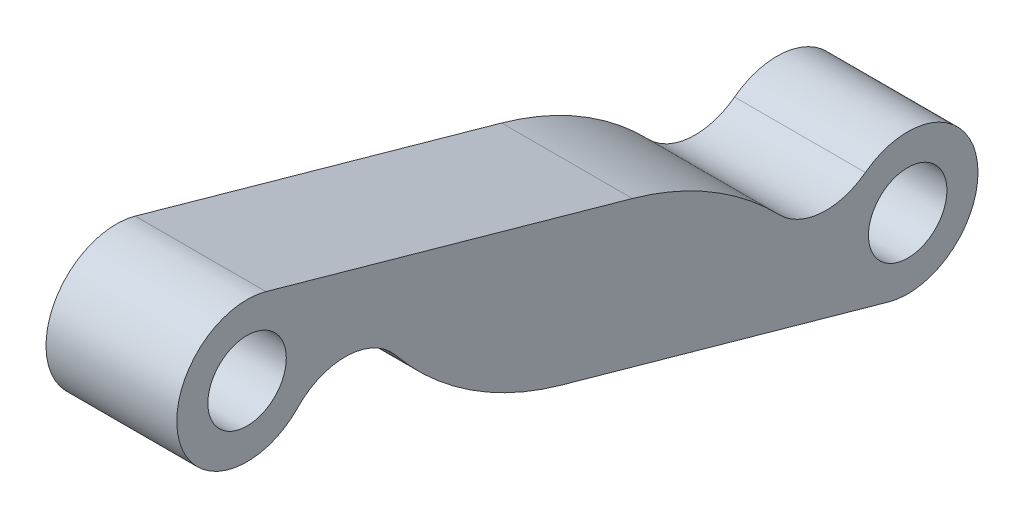
ISO-10303-21;
HEADER;
FILE_DESCRIPTION(('STEP AP214'),'2;1');
FILE_NAME('part.step','',(''),(''),'','','');
FILE_SCHEMA(('AUTOMOTIVE_DESIGN { 1 0 10303 214 1 1 1 1 }'));
ENDSEC;
DATA;
#1=APPLICATION_CONTEXT('core data for automotive mechanical design processes');
#2=APPLICATION_PROTOCOL_DEFINITION('international standard','automotive_design',2000,#1);
#3=PRODUCT_CONTEXT('',#1,'mechanical');
#4=PRODUCT('Part','Part','',(#3));
#5=PRODUCT_RELATED_PRODUCT_CATEGORY('part','',(#4));
#6=PRODUCT_DEFINITION_FORMATION('','',#4);
#7=PRODUCT_DEFINITION_CONTEXT('part definition',#1,'design');
#8=PRODUCT_DEFINITION('design','',#6,#7);
#9=PRODUCT_DEFINITION_SHAPE('','',#8);
#10=(LENGTH_UNIT() NAMED_UNIT(*) SI_UNIT(.MILLI.,.METRE.));
#11=(NAMED_UNIT(*) PLANE_ANGLE_UNIT() SI_UNIT($,.RADIAN.));
#12=(NAMED_UNIT(*) SI_UNIT($,.STERADIAN.) SOLID_ANGLE_UNIT());
#13=UNCERTAINTY_MEASURE_WITH_UNIT(LENGTH_MEASURE(1.E-05),#10,'distance_accuracy_value','');
#14=(GEOMETRIC_REPRESENTATION_CONTEXT(3) GLOBAL_UNCERTAINTY_ASSIGNED_CONTEXT((#13)) GLOBAL_UNIT_ASSIGNED_CONTEXT((#10,
#11,#12)) REPRESENTATION_CONTEXT('',''));
#15=CARTESIAN_POINT('',(0.,0.,0.));
#16=DIRECTION('',(0.,0.,1.));
#17=DIRECTION('',(1.,0.,0.));
#18=AXIS2_PLACEMENT_3D('',#15,#16,#17);
#19=CARTESIAN_POINT('',(-2.,7.67065108363029,-2.14746223561977));
#20=DIRECTION('',(0.,-0.962974451836262,0.269592665164783));
#21=DIRECTION('',(0.,-0.269592665164783,-0.962974451836262));
#22=AXIS2_PLACEMENT_3D('',#19,#20,#21);
#23=PLANE('',#22);
#24=DIRECTION('',(0.,-0.269592665164783,-0.962974451836262));
#25=VECTOR('',#24,1.);
#26=CARTESIAN_POINT('',(2.,7.67065108363029,-2.14746223561977));
#27=LINE('',#26,#25);
#28=CARTESIAN_POINT('',(2.,-2.09525455877692,-37.0308950876729));
#29=VERTEX_POINT('',#28);
#30=CARTESIAN_POINT('',(2.,-4.89882219619411,-47.0451289956227));
#31=VERTEX_POINT('',#30);
#32=EDGE_CURVE('E102',#29,#31,#27,.T.);
#33=ORIENTED_EDGE('',*,*,#32,.F.);
#34=DIRECTION('',(-1.,0.,0.));
#35=VECTOR('',#34,1.);
#36=CARTESIAN_POINT('',(-2.,-2.09525455877692,-37.0308950876729));
#37=LINE('',#36,#35);
#38=CARTESIAN_POINT('',(-2.,-2.09525455877692,-37.0308950876729));
#39=VERTEX_POINT('',#38);
#40=EDGE_CURVE('E11',#29,#39,#37,.T.);
#41=ORIENTED_EDGE('',*,*,#40,.T.);
#42=DIRECTION('',(0.,-0.269592665164783,-0.962974451836262));
#43=VECTOR('',#42,1.);
#44=CARTESIAN_POINT('',(-2.,7.67065108363029,-2.14746223561977));
#45=LINE('',#44,#43);
#46=CARTESIAN_POINT('',(-2.,-4.89882219619411,-47.0451289956227));
#47=VERTEX_POINT('',#46);
#48=EDGE_CURVE('E114',#39,#47,#45,.T.);
#49=ORIENTED_EDGE('',*,*,#48,.T.);
#50=DIRECTION('',(1.,0.,0.));
#51=VECTOR('',#50,1.);
#52=CARTESIAN_POINT('',(-2.,-4.89882219619411,-47.0451289956227));
#53=LINE('',#52,#51);
#54=EDGE_CURVE('E113',#47,#31,#53,.T.);
#55=ORIENTED_EDGE('',*,*,#54,.T.);
#56=EDGE_LOOP('',(#33,#41,#49,#55));
#57=FACE_BOUND('',#56,.T.);
#58=ADVANCED_FACE('F39',(#57),#23,.T.);
#59=CARTESIAN_POINT('',(-2.,-0.0390630670417539,-30.4186911776633));
#60=DIRECTION('',(1.,0.,0.));
#61=DIRECTION('',(0.,0.,-1.));
#62=AXIS2_PLACEMENT_3D('',#59,#60,#61);
#63=CYLINDRICAL_SURFACE('',#62,2.00000000000001);
#64=CARTESIAN_POINT('',(-2.,-0.0390630670417539,-30.4186911776633));
#65=DIRECTION('',(1.,0.,0.));
#66=DIRECTION('',(0.,0.,-1.));
#67=AXIS2_PLACEMENT_3D('',#64,#65,#66);
#68=CIRCLE('',#67,2.00000000000001);
#69=CARTESIAN_POINT('',(-2.,1.22319577072949,-31.9700462712728));
#70=VERTEX_POINT('',#69);
#71=CARTESIAN_POINT('',(-2.,1.34285991695243,-28.9729080451331));
#72=VERTEX_POINT('',#71);
#73=EDGE_CURVE('E153',#70,#72,#68,.T.);
#74=ORIENTED_EDGE('',*,*,#73,.F.);
#75=DIRECTION('',(1.,0.,0.));
#76=VECTOR('',#75,1.);
#77=CARTESIAN_POINT('',(-2.,1.22319577072949,-31.9700462712728));
#78=LINE('',#77,#76);
#79=CARTESIAN_POINT('',(2.,1.22319577072949,-31.9700462712728));
#80=VERTEX_POINT('',#79);
#81=EDGE_CURVE('E47',#70,#80,#78,.T.);
#82=ORIENTED_EDGE('',*,*,#81,.T.);
#83=CARTESIAN_POINT('',(2.,-0.0390630670417539,-30.4186911776633));
#84=DIRECTION('',(1.,0.,0.));
#85=DIRECTION('',(0.,0.,-1.));
#86=AXIS2_PLACEMENT_3D('',#83,#84,#85);
#87=CIRCLE('',#86,2.00000000000001);
#88=CARTESIAN_POINT('',(2.,1.34285991695243,-28.9729080451331));
#89=VERTEX_POINT('',#88);
#90=EDGE_CURVE('E134',#80,#89,#87,.T.);
#91=ORIENTED_EDGE('',*,*,#90,.T.);
#92=DIRECTION('',(1.,0.,0.));
#93=VECTOR('',#92,1.);
#94=CARTESIAN_POINT('',(-2.,1.34285991695243,-28.9729080451331));
#95=LINE('',#94,#93);
#96=EDGE_CURVE('E160',#72,#89,#95,.T.);
#97=ORIENTED_EDGE('',*,*,#96,.F.);
#98=EDGE_LOOP('',(#74,#82,#91,#97));
#99=FACE_BOUND('',#98,.T.);
#100=ADVANCED_FACE('F179',(#99),#63,.F.);
#101=CARTESIAN_POINT('',(-2.,2.82842712474618,-27.4186911776633));
#102=DIRECTION('',(1.,0.,0.));
#103=DIRECTION('',(0.,0.,-1.));
#104=AXIS2_PLACEMENT_3D('',#101,#102,#103);
#105=CYLINDRICAL_SURFACE('',#104,2.15);
#106=ORIENTED_EDGE('',*,*,#96,.T.);
#107=CARTESIAN_POINT('',(2.,2.82842712474618,-27.4186911776633));
#108=DIRECTION('',(1.,0.,0.));
#109=DIRECTION('',(0.,0.,-1.));
#110=AXIS2_PLACEMENT_3D('',#107,#108,#109);
#111=CIRCLE('',#110,2.15);
#112=CARTESIAN_POINT('',(2.,4.89882219619414,-27.9983154077675));
#113=VERTEX_POINT('',#112);
#114=EDGE_CURVE('E131',#113,#89,#111,.T.);
#115=ORIENTED_EDGE('',*,*,#114,.F.);
#116=DIRECTION('',(1.,0.,0.));
#117=VECTOR('',#116,1.);
#118=CARTESIAN_POINT('',(-2.,4.89882219619414,-27.9983154077675));
#119=LINE('',#118,#117);
#120=CARTESIAN_POINT('',(-2.,4.89882219619414,-27.9983154077675));
#121=VERTEX_POINT('',#120);
#122=EDGE_CURVE('E164',#121,#113,#119,.T.);
#123=ORIENTED_EDGE('',*,*,#122,.F.);
#124=CARTESIAN_POINT('',(-2.,2.82842712474618,-27.4186911776633));
#125=DIRECTION('',(1.,0.,0.));
#126=DIRECTION('',(0.,0.,-1.));
#127=AXIS2_PLACEMENT_3D('',#124,#125,#126);
#128=CIRCLE('',#127,2.15);
#129=EDGE_CURVE('E150',#121,#72,#128,.T.);
#130=ORIENTED_EDGE('',*,*,#129,.T.);
#131=EDGE_LOOP('',(#106,#115,#123,#130));
#132=FACE_BOUND('',#131,.T.);
#133=ADVANCED_FACE('F185',(#132),#105,.T.);
#134=CARTESIAN_POINT('',(-2.,11.8114412265263,-3.30671069582839));
#135=DIRECTION('',(0.,-0.962974451836261,0.269592665164785));
#136=DIRECTION('',(0.,-0.269592665164785,-0.962974451836262));
#137=AXIS2_PLACEMENT_3D('',#134,#135,#136);
#138=PLANE('',#137);
#139=DIRECTION('',(0.,-0.269592665164785,-0.962974451836262));
#140=VECTOR('',#139,1.);
#141=CARTESIAN_POINT('',(2.,11.8114412265263,-3.30671069582839));
#142=LINE('',#141,#140);
#143=CARTESIAN_POINT('',(2.,1.76159384554701,-39.2043723285039));
#144=VERTEX_POINT('',#143);
#145=EDGE_CURVE('E126',#113,#144,#142,.T.);
#146=ORIENTED_EDGE('',*,*,#145,.T.);
#147=DIRECTION('',(1.,0.,0.));
#148=VECTOR('',#147,1.);
#149=CARTESIAN_POINT('',(-2.,1.76159384554701,-39.2043723285039));
#150=LINE('',#149,#148);
#151=CARTESIAN_POINT('',(-2.,1.76159384554701,-39.2043723285039));
#152=VERTEX_POINT('',#151);
#153=EDGE_CURVE('E172',#144,#152,#150,.F.);
#154=ORIENTED_EDGE('',*,*,#153,.T.);
#155=DIRECTION('',(0.,-0.269592665164785,-0.962974451836262));
#156=VECTOR('',#155,1.);
#157=CARTESIAN_POINT('',(-2.,11.8114412265263,-3.30671069582839));
#158=LINE('',#157,#156);
#159=EDGE_CURVE('E147',#121,#152,#158,.T.);
#160=ORIENTED_EDGE('',*,*,#159,.F.);
#161=ORIENTED_EDGE('',*,*,#122,.T.);
#162=EDGE_LOOP('',(#146,#154,#160,#161));
#163=FACE_BOUND('',#162,.T.);
#164=ADVANCED_FACE('F199',(#163),#138,.F.);
#165=CARTESIAN_POINT('',(-2.,0.484049290264224,-45.1247532257269));
#166=DIRECTION('',(1.,0.,0.));
#167=DIRECTION('',(0.,0.,-1.));
#168=AXIS2_PLACEMENT_3D('',#165,#166,#167);
#169=CYLINDRICAL_SURFACE('',#168,2.);
#170=CARTESIAN_POINT('',(-2.,0.484049290264224,-45.1247532257269));
#171=DIRECTION('',(1.,0.,0.));
#172=DIRECTION('',(0.,0.,-1.));
#173=AXIS2_PLACEMENT_3D('',#170,#171,#172);
#174=CIRCLE('',#173,2.);
#175=CARTESIAN_POINT('',(-2.,-0.907984036915747,-43.6887019675818));
#176=VERTEX_POINT('',#175);
#177=CARTESIAN_POINT('',(-2.,-1.11232488564439,-46.3295725028354));
#178=VERTEX_POINT('',#177);
#179=EDGE_CURVE('E145',#176,#178,#174,.T.);
#180=ORIENTED_EDGE('',*,*,#179,.F.);
#181=DIRECTION('',(1.,0.,0.));
#182=VECTOR('',#181,1.);
#183=CARTESIAN_POINT('',(-2.,-0.907984036915747,-43.6887019675818));
#184=LINE('',#183,#182);
#185=CARTESIAN_POINT('',(2.,-0.907984036915747,-43.6887019675818));
#186=VERTEX_POINT('',#185);
#187=EDGE_CURVE('E163',#176,#186,#184,.T.);
#188=ORIENTED_EDGE('',*,*,#187,.T.);
#189=CARTESIAN_POINT('',(2.,0.484049290264224,-45.1247532257269));
#190=DIRECTION('',(1.,0.,0.));
#191=DIRECTION('',(0.,0.,-1.));
#192=AXIS2_PLACEMENT_3D('',#189,#190,#191);
#193=CIRCLE('',#192,2.);
#194=CARTESIAN_POINT('',(2.,-1.11232488564439,-46.3295725028354));
#195=VERTEX_POINT('',#194);
#196=EDGE_CURVE('E124',#186,#195,#193,.T.);
#197=ORIENTED_EDGE('',*,*,#196,.T.);
#198=DIRECTION('',(1.,0.,0.));
#199=VECTOR('',#198,1.);
#200=CARTESIAN_POINT('',(-2.,-1.11232488564439,-46.3295725028354));
#201=LINE('',#200,#199);
#202=EDGE_CURVE('E118',#178,#195,#201,.T.);
#203=ORIENTED_EDGE('',*,*,#202,.F.);
#204=EDGE_LOOP('',(#180,#188,#197,#203));
#205=FACE_BOUND('',#204,.T.);
#206=ADVANCED_FACE('F198',(#205),#169,.F.);
#207=CARTESIAN_POINT('',(-2.,2.82842712474618,-27.4186911776633));
#208=DIRECTION('',(1.,0.,0.));
#209=DIRECTION('',(0.,0.,-1.));
#210=AXIS2_PLACEMENT_3D('',#207,#208,#209);
#211=CYLINDRICAL_SURFACE('',#210,1.2);
#212=CARTESIAN_POINT('',(-2.,2.82842712474618,-27.4186911776633));
#213=DIRECTION('',(1.,0.,0.));
#214=DIRECTION('',(0.,0.,-1.));
#215=AXIS2_PLACEMENT_3D('',#212,#213,#214);
#216=CIRCLE('',#215,1.2);
#217=CARTESIAN_POINT('',(-2.,2.82842712474618,-28.6186911776633));
#218=VERTEX_POINT('',#217);
#219=EDGE_CURVE('E155',#218,#218,#216,.T.);
#220=ORIENTED_EDGE('',*,*,#219,.F.);
#221=EDGE_LOOP('',(#220));
#222=FACE_BOUND('',#221,.T.);
#223=CARTESIAN_POINT('',(2.,2.82842712474618,-27.4186911776633));
#224=DIRECTION('',(1.,0.,0.));
#225=DIRECTION('',(0.,0.,-1.));
#226=AXIS2_PLACEMENT_3D('',#223,#224,#225);
#227=CIRCLE('',#226,1.2);
#228=CARTESIAN_POINT('',(2.,2.82842712474618,-28.6186911776633));
#229=VERTEX_POINT('',#228);
#230=EDGE_CURVE('E136',#229,#229,#227,.T.);
#231=ORIENTED_EDGE('',*,*,#230,.T.);
#232=EDGE_LOOP('',(#231));
#233=FACE_BOUND('',#232,.T.);
#234=ADVANCED_FACE('F206',(#222,#233),#211,.F.);
#235=CARTESIAN_POINT('',(-2.,-2.82842712474615,-47.6247532257269));
#236=DIRECTION('',(1.,0.,0.));
#237=DIRECTION('',(0.,0.,-1.));
#238=AXIS2_PLACEMENT_3D('',#235,#236,#237);
#239=CYLINDRICAL_SURFACE('',#238,2.15);
#240=ORIENTED_EDGE('',*,*,#202,.T.);
#241=CARTESIAN_POINT('',(2.,-2.82842712474615,-47.6247532257269));
#242=DIRECTION('',(1.,0.,0.));
#243=DIRECTION('',(0.,0.,-1.));
#244=AXIS2_PLACEMENT_3D('',#241,#242,#243);
#245=CIRCLE('',#244,2.15);
#246=EDGE_CURVE('E108',#31,#195,#245,.T.);
#247=ORIENTED_EDGE('',*,*,#246,.F.);
#248=ORIENTED_EDGE('',*,*,#54,.F.);
#249=CARTESIAN_POINT('',(-2.,-2.82842712474615,-47.6247532257269));
#250=DIRECTION('',(1.,0.,0.));
#251=DIRECTION('',(0.,0.,-1.));
#252=AXIS2_PLACEMENT_3D('',#249,#250,#251);
#253=CIRCLE('',#252,2.15);
#254=EDGE_CURVE('E143',#47,#178,#253,.T.);
#255=ORIENTED_EDGE('',*,*,#254,.T.);
#256=EDGE_LOOP('',(#240,#247,#248,#255));
#257=FACE_BOUND('',#256,.T.);
#258=ADVANCED_FACE('F122',(#257),#239,.T.);
#259=CARTESIAN_POINT('',(-2.,-2.82842712474615,-47.6247532257269));
#260=DIRECTION('',(1.,0.,0.));
#261=DIRECTION('',(0.,0.,-1.));
#262=AXIS2_PLACEMENT_3D('',#259,#260,#261);
#263=CYLINDRICAL_SURFACE('',#262,1.19999999999999);
#264=CARTESIAN_POINT('',(-2.,-2.82842712474615,-47.6247532257269));
#265=DIRECTION('',(1.,0.,0.));
#266=DIRECTION('',(0.,0.,-1.));
#267=AXIS2_PLACEMENT_3D('',#264,#265,#266);
#268=CIRCLE('',#267,1.19999999999999);
#269=CARTESIAN_POINT('',(-2.,-2.82842712474615,-48.8247532257269));
#270=VERTEX_POINT('',#269);
#271=EDGE_CURVE('E119',#270,#270,#268,.T.);
#272=ORIENTED_EDGE('',*,*,#271,.F.);
#273=EDGE_LOOP('',(#272));
#274=FACE_BOUND('',#273,.T.);
#275=CARTESIAN_POINT('',(2.,-2.82842712474615,-47.6247532257269));
#276=DIRECTION('',(1.,0.,0.));
#277=DIRECTION('',(0.,0.,-1.));
#278=AXIS2_PLACEMENT_3D('',#275,#276,#277);
#279=CIRCLE('',#278,1.19999999999999);
#280=CARTESIAN_POINT('',(2.,-2.82842712474615,-48.8247532257269));
#281=VERTEX_POINT('',#280);
#282=EDGE_CURVE('E139',#281,#281,#279,.T.);
#283=ORIENTED_EDGE('',*,*,#282,.T.);
#284=EDGE_LOOP('',(#283));
#285=FACE_BOUND('',#284,.T.);
#286=ADVANCED_FACE('F225',(#274,#285),#263,.F.);
#287=CARTESIAN_POINT('',(-2.,0.,0.));
#288=DIRECTION('',(1.,0.,0.));
#289=DIRECTION('',(0.,0.,-1.));
#290=AXIS2_PLACEMENT_3D('',#287,#288,#289);
#291=PLANE('',#290);
#292=ORIENTED_EDGE('',*,*,#159,.T.);
#293=CARTESIAN_POINT('',(-2.,-7.8681506728156,-36.5084456768561));
#294=DIRECTION('',(1.,0.,0.));
#295=DIRECTION('',(0.,0.,-1.));
#296=AXIS2_PLACEMENT_3D('',#293,#294,#295);
#297=CIRCLE('',#296,10.);
#298=EDGE_CURVE('E175',#152,#176,#297,.F.);
#299=ORIENTED_EDGE('',*,*,#298,.T.);
#300=ORIENTED_EDGE('',*,*,#179,.T.);
#301=ORIENTED_EDGE('',*,*,#254,.F.);
#302=ORIENTED_EDGE('',*,*,#48,.F.);
#303=CARTESIAN_POINT('',(-2.,7.5344899595857,-39.7268217393208));
#304=DIRECTION('',(1.,0.,0.));
#305=DIRECTION('',(0.,0.,-1.));
#306=AXIS2_PLACEMENT_3D('',#303,#304,#305);
#307=CIRCLE('',#306,10.);
#308=EDGE_CURVE('E54',#39,#70,#307,.F.);
#309=ORIENTED_EDGE('',*,*,#308,.T.);
#310=ORIENTED_EDGE('',*,*,#73,.T.);
#311=ORIENTED_EDGE('',*,*,#129,.F.);
#312=EDGE_LOOP('',(#292,#299,#300,#301,#302,#309,#310,#311));
#313=FACE_BOUND('',#312,.T.);
#314=ORIENTED_EDGE('',*,*,#219,.T.);
#315=EDGE_LOOP('',(#314));
#316=FACE_BOUND('',#315,.T.);
#317=ORIENTED_EDGE('',*,*,#271,.T.);
#318=EDGE_LOOP('',(#317));
#319=FACE_BOUND('',#318,.T.);
#320=ADVANCED_FACE('F188',(#313,#316,#319),#291,.F.);
#321=CARTESIAN_POINT('',(2.,0.,0.));
#322=DIRECTION('',(1.,0.,0.));
#323=DIRECTION('',(0.,0.,-1.));
#324=AXIS2_PLACEMENT_3D('',#321,#322,#323);
#325=PLANE('',#324);
#326=ORIENTED_EDGE('',*,*,#196,.F.);
#327=CARTESIAN_POINT('',(2.,-7.8681506728156,-36.5084456768561));
#328=DIRECTION('',(1.,0.,0.));
#329=DIRECTION('',(0.,0.,-1.));
#330=AXIS2_PLACEMENT_3D('',#327,#328,#329);
#331=CIRCLE('',#330,10.);
#332=EDGE_CURVE('E170',#186,#144,#331,.T.);
#333=ORIENTED_EDGE('',*,*,#332,.T.);
#334=ORIENTED_EDGE('',*,*,#145,.F.);
#335=ORIENTED_EDGE('',*,*,#114,.T.);
#336=ORIENTED_EDGE('',*,*,#90,.F.);
#337=CARTESIAN_POINT('',(2.,7.5344899595857,-39.7268217393208));
#338=DIRECTION('',(1.,0.,0.));
#339=DIRECTION('',(0.,0.,-1.));
#340=AXIS2_PLACEMENT_3D('',#337,#338,#339);
#341=CIRCLE('',#340,10.);
#342=EDGE_CURVE('E110',#80,#29,#341,.T.);
#343=ORIENTED_EDGE('',*,*,#342,.T.);
#344=ORIENTED_EDGE('',*,*,#32,.T.);
#345=ORIENTED_EDGE('',*,*,#246,.T.);
#346=EDGE_LOOP('',(#326,#333,#334,#335,#336,#343,#344,#345));
#347=FACE_BOUND('',#346,.T.);
#348=ORIENTED_EDGE('',*,*,#230,.F.);
#349=EDGE_LOOP('',(#348));
#350=FACE_BOUND('',#349,.T.);
#351=ORIENTED_EDGE('',*,*,#282,.F.);
#352=EDGE_LOOP('',(#351));
#353=FACE_BOUND('',#352,.T.);
#354=ADVANCED_FACE('F105',(#347,#350,#353),#325,.T.);
#355=CARTESIAN_POINT('',(-2.,-7.8681506728156,-36.5084456768561));
#356=DIRECTION('',(1.,0.,0.));
#357=DIRECTION('',(0.,0.,-1.));
#358=AXIS2_PLACEMENT_3D('',#355,#356,#357);
#359=CYLINDRICAL_SURFACE('',#358,10.);
#360=ORIENTED_EDGE('',*,*,#298,.F.);
#361=ORIENTED_EDGE('',*,*,#153,.F.);
#362=ORIENTED_EDGE('',*,*,#332,.F.);
#363=ORIENTED_EDGE('',*,*,#187,.F.);
#364=EDGE_LOOP('',(#360,#361,#362,#363));
#365=FACE_BOUND('',#364,.T.);
#366=ADVANCED_FACE('F196',(#365),#359,.T.);
#367=CARTESIAN_POINT('',(-2.,7.5344899595857,-39.7268217393208));
#368=DIRECTION('',(1.,0.,0.));
#369=DIRECTION('',(0.,0.,-1.));
#370=AXIS2_PLACEMENT_3D('',#367,#368,#369);
#371=CYLINDRICAL_SURFACE('',#370,10.);
#372=ORIENTED_EDGE('',*,*,#308,.F.);
#373=ORIENTED_EDGE('',*,*,#40,.F.);
#374=ORIENTED_EDGE('',*,*,#342,.F.);
#375=ORIENTED_EDGE('',*,*,#81,.F.);
#376=EDGE_LOOP('',(#372,#373,#374,#375));
#377=FACE_BOUND('',#376,.T.);
#378=ADVANCED_FACE('F41',(#377),#371,.T.);
#379=CLOSED_SHELL('',(#58,#100,#133,#164,#206,#234,#258,#286,#320,#354,#366,#378));
#380=MANIFOLD_SOLID_BREP('B2',#379);
#381=ADVANCED_BREP_SHAPE_REPRESENTATION('',(#18,#380),#14);
#382=SHAPE_DEFINITION_REPRESENTATION(#9,#381);
ENDSEC;
END-ISO-10303-21;
